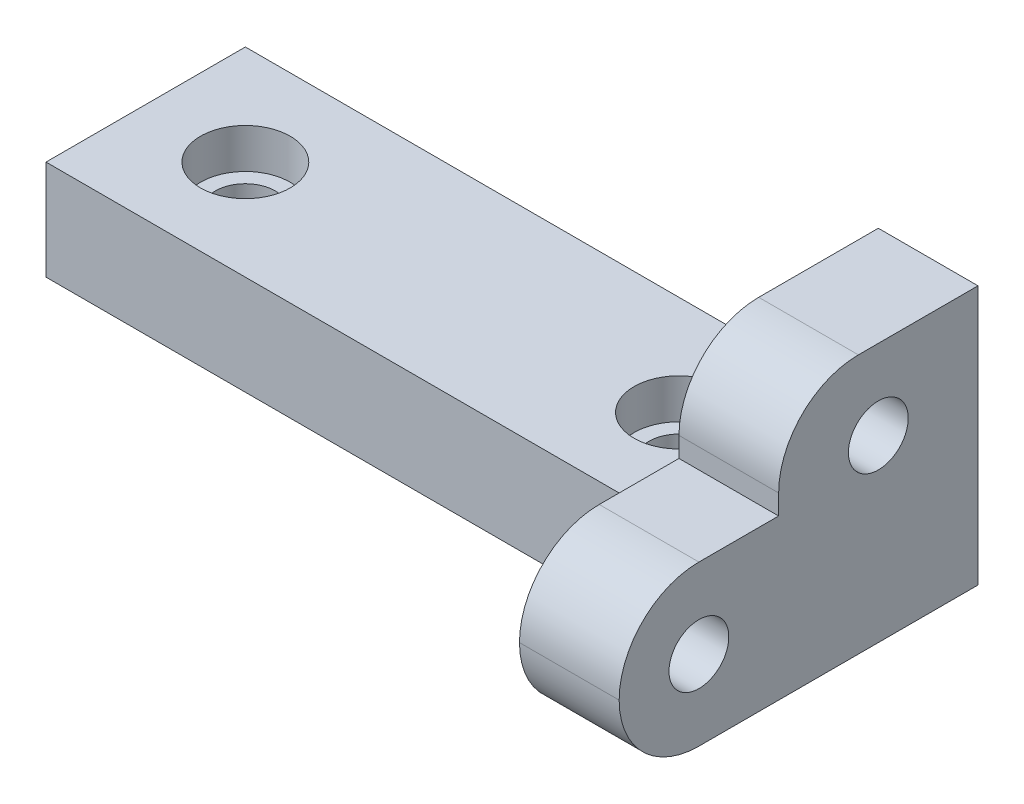
ISO-10303-21;
HEADER;
FILE_DESCRIPTION(('STEP AP214'),'2;1');
FILE_NAME('part.step','',(''),(''),'','','');
FILE_SCHEMA(('AUTOMOTIVE_DESIGN { 1 0 10303 214 1 1 1 1 }'));
ENDSEC;
DATA;
#1=APPLICATION_CONTEXT('core data for automotive mechanical design processes');
#2=APPLICATION_PROTOCOL_DEFINITION('international standard','automotive_design',2000,#1);
#3=PRODUCT_CONTEXT('',#1,'mechanical');
#4=PRODUCT('Part','Part','',(#3));
#5=PRODUCT_RELATED_PRODUCT_CATEGORY('part','',(#4));
#6=PRODUCT_DEFINITION_FORMATION('','',#4);
#7=PRODUCT_DEFINITION_CONTEXT('part definition',#1,'design');
#8=PRODUCT_DEFINITION('design','',#6,#7);
#9=PRODUCT_DEFINITION_SHAPE('','',#8);
#10=(LENGTH_UNIT() NAMED_UNIT(*) SI_UNIT(.MILLI.,.METRE.));
#11=(NAMED_UNIT(*) PLANE_ANGLE_UNIT() SI_UNIT($,.RADIAN.));
#12=(NAMED_UNIT(*) SI_UNIT($,.STERADIAN.) SOLID_ANGLE_UNIT());
#13=UNCERTAINTY_MEASURE_WITH_UNIT(LENGTH_MEASURE(1.E-05),#10,'distance_accuracy_value','');
#14=(GEOMETRIC_REPRESENTATION_CONTEXT(3) GLOBAL_UNCERTAINTY_ASSIGNED_CONTEXT((#13)) GLOBAL_UNIT_ASSIGNED_CONTEXT((#10,
#11,#12)) REPRESENTATION_CONTEXT('',''));
#15=CARTESIAN_POINT('',(0.,0.,0.));
#16=DIRECTION('',(0.,0.,1.));
#17=DIRECTION('',(1.,0.,0.));
#18=AXIS2_PLACEMENT_3D('',#15,#16,#17);
#19=CARTESIAN_POINT('',(0.,9.,5.));
#20=DIRECTION('',(-1.,0.,0.));
#21=DIRECTION('',(0.,0.,1.));
#22=AXIS2_PLACEMENT_3D('',#19,#20,#21);
#23=CYLINDRICAL_SURFACE('',#22,1.5);
#24=CARTESIAN_POINT('',(0.,9.,5.));
#25=DIRECTION('',(-1.,0.,0.));
#26=DIRECTION('',(0.,0.,1.));
#27=AXIS2_PLACEMENT_3D('',#24,#25,#26);
#28=CIRCLE('',#27,1.5);
#29=CARTESIAN_POINT('',(0.,9.,6.5));
#30=VERTEX_POINT('',#29);
#31=EDGE_CURVE('E146',#30,#30,#28,.T.);
#32=ORIENTED_EDGE('',*,*,#31,.F.);
#33=EDGE_LOOP('',(#32));
#34=FACE_BOUND('',#33,.T.);
#35=CARTESIAN_POINT('',(-3.,9.,5.));
#36=DIRECTION('',(-1.,0.,0.));
#37=DIRECTION('',(0.,0.,1.));
#38=AXIS2_PLACEMENT_3D('',#35,#36,#37);
#39=CIRCLE('',#38,1.5);
#40=CARTESIAN_POINT('',(-3.,9.,6.5));
#41=VERTEX_POINT('',#40);
#42=EDGE_CURVE('E193',#41,#41,#39,.F.);
#43=ORIENTED_EDGE('',*,*,#42,.F.);
#44=EDGE_LOOP('',(#43));
#45=FACE_BOUND('',#44,.T.);
#46=ADVANCED_FACE('F35',(#34,#45),#23,.F.);
#47=CARTESIAN_POINT('',(0.,4.,14.));
#48=DIRECTION('',(-1.,0.,0.));
#49=DIRECTION('',(0.,0.,1.));
#50=AXIS2_PLACEMENT_3D('',#47,#48,#49);
#51=CYLINDRICAL_SURFACE('',#50,1.5);
#52=CARTESIAN_POINT('',(0.,4.,14.));
#53=DIRECTION('',(-1.,0.,0.));
#54=DIRECTION('',(0.,0.,1.));
#55=AXIS2_PLACEMENT_3D('',#52,#53,#54);
#56=CIRCLE('',#55,1.5);
#57=CARTESIAN_POINT('',(0.,4.,15.5));
#58=VERTEX_POINT('',#57);
#59=EDGE_CURVE('E197',#58,#58,#56,.T.);
#60=ORIENTED_EDGE('',*,*,#59,.F.);
#61=EDGE_LOOP('',(#60));
#62=FACE_BOUND('',#61,.T.);
#63=CARTESIAN_POINT('',(-3.,4.,14.));
#64=DIRECTION('',(-1.,0.,0.));
#65=DIRECTION('',(0.,0.,1.));
#66=AXIS2_PLACEMENT_3D('',#63,#64,#65);
#67=CIRCLE('',#66,1.5);
#68=CARTESIAN_POINT('',(-3.,4.,15.5));
#69=VERTEX_POINT('',#68);
#70=EDGE_CURVE('E190',#69,#69,#67,.F.);
#71=ORIENTED_EDGE('',*,*,#70,.F.);
#72=EDGE_LOOP('',(#71));
#73=FACE_BOUND('',#72,.T.);
#74=ADVANCED_FACE('F262',(#62,#73),#51,.F.);
#75=CARTESIAN_POINT('',(0.,5.,0.));
#76=DIRECTION('',(0.,-1.,0.));
#77=DIRECTION('',(0.,0.,-1.));
#78=AXIS2_PLACEMENT_3D('',#75,#76,#77);
#79=PLANE('',#78);
#80=CARTESIAN_POINT('',(-31.75,5.,5.));
#81=DIRECTION('',(0.,1.,0.));
#82=DIRECTION('',(0.,0.,1.));
#83=AXIS2_PLACEMENT_3D('',#80,#81,#82);
#84=CIRCLE('',#83,2.25);
#85=CARTESIAN_POINT('',(-31.75,5.,7.25));
#86=VERTEX_POINT('',#85);
#87=EDGE_CURVE('E374',#86,#86,#84,.T.);
#88=ORIENTED_EDGE('',*,*,#87,.F.);
#89=EDGE_LOOP('',(#88));
#90=FACE_BOUND('',#89,.T.);
#91=CARTESIAN_POINT('',(-10.,5.,5.));
#92=DIRECTION('',(0.,1.,0.));
#93=DIRECTION('',(0.,0.,1.));
#94=AXIS2_PLACEMENT_3D('',#91,#92,#93);
#95=CIRCLE('',#94,2.25);
#96=CARTESIAN_POINT('',(-10.,5.,7.25));
#97=VERTEX_POINT('',#96);
#98=EDGE_CURVE('E371',#97,#97,#95,.T.);
#99=ORIENTED_EDGE('',*,*,#98,.F.);
#100=EDGE_LOOP('',(#99));
#101=FACE_BOUND('',#100,.T.);
#102=DIRECTION('',(0.,0.,1.));
#103=VECTOR('',#102,1.);
#104=CARTESIAN_POINT('',(-5.,5.,0.));
#105=LINE('',#104,#103);
#106=CARTESIAN_POINT('',(-5.,5.,0.));
#107=VERTEX_POINT('',#106);
#108=CARTESIAN_POINT('',(-5.,5.,10.));
#109=VERTEX_POINT('',#108);
#110=EDGE_CURVE('E154',#107,#109,#105,.T.);
#111=ORIENTED_EDGE('',*,*,#110,.F.);
#112=DIRECTION('',(-1.,0.,0.));
#113=VECTOR('',#112,1.);
#114=CARTESIAN_POINT('',(0.,5.,0.));
#115=LINE('',#114,#113);
#116=CARTESIAN_POINT('',(-36.75,5.,0.));
#117=VERTEX_POINT('',#116);
#118=EDGE_CURVE('E174',#107,#117,#115,.T.);
#119=ORIENTED_EDGE('',*,*,#118,.T.);
#120=DIRECTION('',(0.,0.,1.));
#121=VECTOR('',#120,1.);
#122=CARTESIAN_POINT('',(-36.75,5.,0.));
#123=LINE('',#122,#121);
#124=CARTESIAN_POINT('',(-36.75,5.,10.));
#125=VERTEX_POINT('',#124);
#126=EDGE_CURVE('E170',#117,#125,#123,.T.);
#127=ORIENTED_EDGE('',*,*,#126,.T.);
#128=DIRECTION('',(-1.,0.,0.));
#129=VECTOR('',#128,1.);
#130=CARTESIAN_POINT('',(0.,5.,10.));
#131=LINE('',#130,#129);
#132=EDGE_CURVE('E168',#109,#125,#131,.T.);
#133=ORIENTED_EDGE('',*,*,#132,.F.);
#134=EDGE_LOOP('',(#111,#119,#127,#133));
#135=FACE_BOUND('',#134,.T.);
#136=ADVANCED_FACE('F233',(#90,#101,#135),#79,.F.);
#137=CARTESIAN_POINT('',(0.,5.,0.));
#138=DIRECTION('',(1.,0.,0.));
#139=DIRECTION('',(0.,0.,-1.));
#140=AXIS2_PLACEMENT_3D('',#137,#138,#139);
#141=PLANE('',#140);
#142=ORIENTED_EDGE('',*,*,#59,.T.);
#143=EDGE_LOOP('',(#142));
#144=FACE_BOUND('',#143,.T.);
#145=ORIENTED_EDGE('',*,*,#31,.T.);
#146=EDGE_LOOP('',(#145));
#147=FACE_BOUND('',#146,.T.);
#148=DIRECTION('',(0.,0.,1.));
#149=VECTOR('',#148,1.);
#150=CARTESIAN_POINT('',(0.,13.,0.));
#151=LINE('',#150,#149);
#152=CARTESIAN_POINT('',(0.,13.,0.));
#153=VERTEX_POINT('',#152);
#154=CARTESIAN_POINT('',(0.,13.,6.));
#155=VERTEX_POINT('',#154);
#156=EDGE_CURVE('E160',#153,#155,#151,.T.);
#157=ORIENTED_EDGE('',*,*,#156,.T.);
#158=CARTESIAN_POINT('',(0.,9.,6.));
#159=DIRECTION('',(1.,0.,0.));
#160=DIRECTION('',(0.,0.,-1.));
#161=AXIS2_PLACEMENT_3D('',#158,#159,#160);
#162=CIRCLE('',#161,4.);
#163=CARTESIAN_POINT('',(0.,9.,10.));
#164=VERTEX_POINT('',#163);
#165=EDGE_CURVE('E124',#155,#164,#162,.T.);
#166=ORIENTED_EDGE('',*,*,#165,.T.);
#167=DIRECTION('',(0.,-1.,0.));
#168=VECTOR('',#167,1.);
#169=CARTESIAN_POINT('',(0.,13.,10.));
#170=LINE('',#169,#168);
#171=CARTESIAN_POINT('',(0.,8.,10.));
#172=VERTEX_POINT('',#171);
#173=EDGE_CURVE('E117',#164,#172,#170,.T.);
#174=ORIENTED_EDGE('',*,*,#173,.T.);
#175=DIRECTION('',(0.,0.,1.));
#176=VECTOR('',#175,1.);
#177=CARTESIAN_POINT('',(0.,8.,10.));
#178=LINE('',#177,#176);
#179=CARTESIAN_POINT('',(0.,8.,14.));
#180=VERTEX_POINT('',#179);
#181=EDGE_CURVE('E122',#172,#180,#178,.T.);
#182=ORIENTED_EDGE('',*,*,#181,.T.);
#183=CARTESIAN_POINT('',(0.,4.,14.));
#184=DIRECTION('',(1.,0.,0.));
#185=DIRECTION('',(0.,0.,-1.));
#186=AXIS2_PLACEMENT_3D('',#183,#184,#185);
#187=CIRCLE('',#186,4.);
#188=CARTESIAN_POINT('',(0.,4.,18.));
#189=VERTEX_POINT('',#188);
#190=EDGE_CURVE('E56',#180,#189,#187,.T.);
#191=ORIENTED_EDGE('',*,*,#190,.T.);
#192=CARTESIAN_POINT('',(0.,4.,14.));
#193=DIRECTION('',(1.,0.,0.));
#194=DIRECTION('',(0.,0.,-1.));
#195=AXIS2_PLACEMENT_3D('',#192,#193,#194);
#196=CIRCLE('',#195,4.);
#197=CARTESIAN_POINT('',(0.,0.,14.));
#198=VERTEX_POINT('',#197);
#199=EDGE_CURVE('E51',#189,#198,#196,.T.);
#200=ORIENTED_EDGE('',*,*,#199,.T.);
#201=DIRECTION('',(0.,0.,1.));
#202=VECTOR('',#201,1.);
#203=CARTESIAN_POINT('',(0.,0.,0.));
#204=LINE('',#203,#202);
#205=CARTESIAN_POINT('',(0.,0.,0.));
#206=VERTEX_POINT('',#205);
#207=EDGE_CURVE('E167',#206,#198,#204,.T.);
#208=ORIENTED_EDGE('',*,*,#207,.F.);
#209=DIRECTION('',(0.,-1.,0.));
#210=VECTOR('',#209,1.);
#211=CARTESIAN_POINT('',(0.,5.,0.));
#212=LINE('',#211,#210);
#213=EDGE_CURVE('E152',#153,#206,#212,.T.);
#214=ORIENTED_EDGE('',*,*,#213,.F.);
#215=EDGE_LOOP('',(#157,#166,#174,#182,#191,#200,#208,#214));
#216=FACE_BOUND('',#215,.T.);
#217=ADVANCED_FACE('F120',(#144,#147,#216),#141,.T.);
#218=CARTESIAN_POINT('',(0.,5.,0.));
#219=DIRECTION('',(0.,0.,1.));
#220=DIRECTION('',(1.,0.,0.));
#221=AXIS2_PLACEMENT_3D('',#218,#219,#220);
#222=PLANE('',#221);
#223=DIRECTION('',(-1.,0.,0.));
#224=VECTOR('',#223,1.);
#225=CARTESIAN_POINT('',(0.,0.,0.));
#226=LINE('',#225,#224);
#227=CARTESIAN_POINT('',(-36.75,0.,0.));
#228=VERTEX_POINT('',#227);
#229=EDGE_CURVE('E171',#206,#228,#226,.T.);
#230=ORIENTED_EDGE('',*,*,#229,.T.);
#231=DIRECTION('',(0.,-1.,0.));
#232=VECTOR('',#231,1.);
#233=CARTESIAN_POINT('',(-36.75,5.,0.));
#234=LINE('',#233,#232);
#235=EDGE_CURVE('E185',#117,#228,#234,.T.);
#236=ORIENTED_EDGE('',*,*,#235,.F.);
#237=ORIENTED_EDGE('',*,*,#118,.F.);
#238=DIRECTION('',(0.,-1.,0.));
#239=VECTOR('',#238,1.);
#240=CARTESIAN_POINT('',(-5.,13.,0.));
#241=LINE('',#240,#239);
#242=CARTESIAN_POINT('',(-5.,13.,0.));
#243=VERTEX_POINT('',#242);
#244=EDGE_CURVE('E162',#243,#107,#241,.T.);
#245=ORIENTED_EDGE('',*,*,#244,.F.);
#246=DIRECTION('',(-1.,0.,0.));
#247=VECTOR('',#246,1.);
#248=CARTESIAN_POINT('',(0.,13.,0.));
#249=LINE('',#248,#247);
#250=EDGE_CURVE('E158',#153,#243,#249,.T.);
#251=ORIENTED_EDGE('',*,*,#250,.F.);
#252=ORIENTED_EDGE('',*,*,#213,.T.);
#253=EDGE_LOOP('',(#230,#236,#237,#245,#251,#252));
#254=FACE_BOUND('',#253,.T.);
#255=ADVANCED_FACE('F245',(#254),#222,.F.);
#256=CARTESIAN_POINT('',(-36.75,5.,0.));
#257=DIRECTION('',(1.,0.,0.));
#258=DIRECTION('',(0.,0.,-1.));
#259=AXIS2_PLACEMENT_3D('',#256,#257,#258);
#260=PLANE('',#259);
#261=DIRECTION('',(0.,0.,1.));
#262=VECTOR('',#261,1.);
#263=CARTESIAN_POINT('',(-36.75,0.,0.));
#264=LINE('',#263,#262);
#265=CARTESIAN_POINT('',(-36.75,0.,10.));
#266=VERTEX_POINT('',#265);
#267=EDGE_CURVE('E180',#228,#266,#264,.T.);
#268=ORIENTED_EDGE('',*,*,#267,.T.);
#269=DIRECTION('',(0.,-1.,0.));
#270=VECTOR('',#269,1.);
#271=CARTESIAN_POINT('',(-36.75,5.,10.));
#272=LINE('',#271,#270);
#273=EDGE_CURVE('E176',#125,#266,#272,.T.);
#274=ORIENTED_EDGE('',*,*,#273,.F.);
#275=ORIENTED_EDGE('',*,*,#126,.F.);
#276=ORIENTED_EDGE('',*,*,#235,.T.);
#277=EDGE_LOOP('',(#268,#274,#275,#276));
#278=FACE_BOUND('',#277,.T.);
#279=ADVANCED_FACE('F239',(#278),#260,.F.);
#280=CARTESIAN_POINT('',(0.,5.,10.));
#281=DIRECTION('',(0.,0.,1.));
#282=DIRECTION('',(1.,0.,0.));
#283=AXIS2_PLACEMENT_3D('',#280,#281,#282);
#284=PLANE('',#283);
#285=DIRECTION('',(0.,-1.,0.));
#286=VECTOR('',#285,1.);
#287=CARTESIAN_POINT('',(-5.,13.,10.));
#288=LINE('',#287,#286);
#289=CARTESIAN_POINT('',(-5.,0.,10.));
#290=VERTEX_POINT('',#289);
#291=EDGE_CURVE('E148',#109,#290,#288,.T.);
#292=ORIENTED_EDGE('',*,*,#291,.F.);
#293=ORIENTED_EDGE('',*,*,#132,.T.);
#294=ORIENTED_EDGE('',*,*,#273,.T.);
#295=DIRECTION('',(-1.,0.,0.));
#296=VECTOR('',#295,1.);
#297=CARTESIAN_POINT('',(0.,0.,10.));
#298=LINE('',#297,#296);
#299=EDGE_CURVE('E178',#290,#266,#298,.T.);
#300=ORIENTED_EDGE('',*,*,#299,.F.);
#301=EDGE_LOOP('',(#292,#293,#294,#300));
#302=FACE_BOUND('',#301,.T.);
#303=ADVANCED_FACE('F231',(#302),#284,.T.);
#304=CARTESIAN_POINT('',(0.,0.,0.));
#305=DIRECTION('',(0.,-1.,0.));
#306=DIRECTION('',(0.,0.,-1.));
#307=AXIS2_PLACEMENT_3D('',#304,#305,#306);
#308=PLANE('',#307);
#309=CARTESIAN_POINT('',(-31.75,0.,5.));
#310=DIRECTION('',(0.,1.,0.));
#311=DIRECTION('',(0.,0.,1.));
#312=AXIS2_PLACEMENT_3D('',#309,#310,#311);
#313=CIRCLE('',#312,1.5);
#314=CARTESIAN_POINT('',(-31.75,0.,6.5));
#315=VERTEX_POINT('',#314);
#316=EDGE_CURVE('E202',#315,#315,#313,.T.);
#317=ORIENTED_EDGE('',*,*,#316,.T.);
#318=EDGE_LOOP('',(#317));
#319=FACE_BOUND('',#318,.T.);
#320=CARTESIAN_POINT('',(-10.,0.,5.));
#321=DIRECTION('',(0.,1.,0.));
#322=DIRECTION('',(0.,0.,1.));
#323=AXIS2_PLACEMENT_3D('',#320,#321,#322);
#324=CIRCLE('',#323,1.5);
#325=CARTESIAN_POINT('',(-10.,0.,6.5));
#326=VERTEX_POINT('',#325);
#327=EDGE_CURVE('E254',#326,#326,#324,.T.);
#328=ORIENTED_EDGE('',*,*,#327,.T.);
#329=EDGE_LOOP('',(#328));
#330=FACE_BOUND('',#329,.T.);
#331=ORIENTED_EDGE('',*,*,#207,.T.);
#332=DIRECTION('',(1.,0.,0.));
#333=VECTOR('',#332,1.);
#334=CARTESIAN_POINT('',(0.,0.,14.));
#335=LINE('',#334,#333);
#336=CARTESIAN_POINT('',(-5.,0.,14.));
#337=VERTEX_POINT('',#336);
#338=EDGE_CURVE('E44',#198,#337,#335,.F.);
#339=ORIENTED_EDGE('',*,*,#338,.T.);
#340=DIRECTION('',(0.,0.,-1.));
#341=VECTOR('',#340,1.);
#342=CARTESIAN_POINT('',(-5.,0.,18.));
#343=LINE('',#342,#341);
#344=EDGE_CURVE('E138',#337,#290,#343,.T.);
#345=ORIENTED_EDGE('',*,*,#344,.T.);
#346=ORIENTED_EDGE('',*,*,#299,.T.);
#347=ORIENTED_EDGE('',*,*,#267,.F.);
#348=ORIENTED_EDGE('',*,*,#229,.F.);
#349=EDGE_LOOP('',(#331,#339,#345,#346,#347,#348));
#350=FACE_BOUND('',#349,.T.);
#351=ADVANCED_FACE('F222',(#319,#330,#350),#308,.T.);
#352=CARTESIAN_POINT('',(-5.,13.,0.));
#353=DIRECTION('',(1.,0.,0.));
#354=DIRECTION('',(0.,0.,-1.));
#355=AXIS2_PLACEMENT_3D('',#352,#353,#354);
#356=PLANE('',#355);
#357=CARTESIAN_POINT('',(-5.,9.,5.));
#358=DIRECTION('',(-1.,0.,0.));
#359=DIRECTION('',(0.,0.,1.));
#360=AXIS2_PLACEMENT_3D('',#357,#358,#359);
#361=CIRCLE('',#360,2.25);
#362=CARTESIAN_POINT('',(-5.,9.,7.25));
#363=VERTEX_POINT('',#362);
#364=EDGE_CURVE('E352',#363,#363,#361,.T.);
#365=ORIENTED_EDGE('',*,*,#364,.F.);
#366=EDGE_LOOP('',(#365));
#367=FACE_BOUND('',#366,.T.);
#368=CARTESIAN_POINT('',(-5.,4.,14.));
#369=DIRECTION('',(-1.,0.,0.));
#370=DIRECTION('',(0.,0.,1.));
#371=AXIS2_PLACEMENT_3D('',#368,#369,#370);
#372=CIRCLE('',#371,2.25);
#373=CARTESIAN_POINT('',(-5.,4.,16.25));
#374=VERTEX_POINT('',#373);
#375=EDGE_CURVE('E350',#374,#374,#372,.T.);
#376=ORIENTED_EDGE('',*,*,#375,.F.);
#377=EDGE_LOOP('',(#376));
#378=FACE_BOUND('',#377,.T.);
#379=DIRECTION('',(0.,-1.,0.));
#380=VECTOR('',#379,1.);
#381=CARTESIAN_POINT('',(-5.,13.,10.));
#382=LINE('',#381,#380);
#383=CARTESIAN_POINT('',(-5.,9.,10.));
#384=VERTEX_POINT('',#383);
#385=CARTESIAN_POINT('',(-5.,8.,10.));
#386=VERTEX_POINT('',#385);
#387=EDGE_CURVE('E134',#384,#386,#382,.T.);
#388=ORIENTED_EDGE('',*,*,#387,.F.);
#389=CARTESIAN_POINT('',(-5.,9.,6.));
#390=DIRECTION('',(1.,0.,0.));
#391=DIRECTION('',(0.,0.,-1.));
#392=AXIS2_PLACEMENT_3D('',#389,#390,#391);
#393=CIRCLE('',#392,4.);
#394=CARTESIAN_POINT('',(-5.,13.,6.));
#395=VERTEX_POINT('',#394);
#396=EDGE_CURVE('E211',#384,#395,#393,.F.);
#397=ORIENTED_EDGE('',*,*,#396,.T.);
#398=DIRECTION('',(0.,0.,1.));
#399=VECTOR('',#398,1.);
#400=CARTESIAN_POINT('',(-5.,13.,0.));
#401=LINE('',#400,#399);
#402=EDGE_CURVE('E155',#243,#395,#401,.T.);
#403=ORIENTED_EDGE('',*,*,#402,.F.);
#404=ORIENTED_EDGE('',*,*,#244,.T.);
#405=ORIENTED_EDGE('',*,*,#110,.T.);
#406=ORIENTED_EDGE('',*,*,#291,.T.);
#407=ORIENTED_EDGE('',*,*,#344,.F.);
#408=CARTESIAN_POINT('',(-5.,4.,14.));
#409=DIRECTION('',(1.,0.,0.));
#410=DIRECTION('',(0.,0.,-1.));
#411=AXIS2_PLACEMENT_3D('',#408,#409,#410);
#412=CIRCLE('',#411,4.);
#413=CARTESIAN_POINT('',(-5.,4.,18.));
#414=VERTEX_POINT('',#413);
#415=EDGE_CURVE('E209',#337,#414,#412,.F.);
#416=ORIENTED_EDGE('',*,*,#415,.T.);
#417=CARTESIAN_POINT('',(-5.,4.,14.));
#418=DIRECTION('',(1.,0.,0.));
#419=DIRECTION('',(0.,0.,-1.));
#420=AXIS2_PLACEMENT_3D('',#417,#418,#419);
#421=CIRCLE('',#420,4.);
#422=CARTESIAN_POINT('',(-5.,8.,14.));
#423=VERTEX_POINT('',#422);
#424=EDGE_CURVE('E207',#414,#423,#421,.F.);
#425=ORIENTED_EDGE('',*,*,#424,.T.);
#426=DIRECTION('',(0.,0.,1.));
#427=VECTOR('',#426,1.);
#428=CARTESIAN_POINT('',(-5.,8.,10.));
#429=LINE('',#428,#427);
#430=EDGE_CURVE('E128',#386,#423,#429,.T.);
#431=ORIENTED_EDGE('',*,*,#430,.F.);
#432=EDGE_LOOP('',(#388,#397,#403,#404,#405,#406,#407,#416,#425,#431));
#433=FACE_BOUND('',#432,.T.);
#434=ADVANCED_FACE('F227',(#367,#378,#433),#356,.F.);
#435=CARTESIAN_POINT('',(0.,13.,0.));
#436=DIRECTION('',(0.,1.,0.));
#437=DIRECTION('',(0.,0.,1.));
#438=AXIS2_PLACEMENT_3D('',#435,#436,#437);
#439=PLANE('',#438);
#440=ORIENTED_EDGE('',*,*,#402,.T.);
#441=DIRECTION('',(-1.,0.,0.));
#442=VECTOR('',#441,1.);
#443=CARTESIAN_POINT('',(0.,13.,6.));
#444=LINE('',#443,#442);
#445=EDGE_CURVE('E213',#395,#155,#444,.F.);
#446=ORIENTED_EDGE('',*,*,#445,.T.);
#447=ORIENTED_EDGE('',*,*,#156,.F.);
#448=ORIENTED_EDGE('',*,*,#250,.T.);
#449=EDGE_LOOP('',(#440,#446,#447,#448));
#450=FACE_BOUND('',#449,.T.);
#451=ADVANCED_FACE('F248',(#450),#439,.T.);
#452=CARTESIAN_POINT('',(0.,13.,10.));
#453=DIRECTION('',(0.,0.,-1.));
#454=DIRECTION('',(-1.,0.,0.));
#455=AXIS2_PLACEMENT_3D('',#452,#453,#454);
#456=PLANE('',#455);
#457=ORIENTED_EDGE('',*,*,#173,.F.);
#458=DIRECTION('',(-1.,0.,0.));
#459=VECTOR('',#458,1.);
#460=CARTESIAN_POINT('',(-5.,9.,10.));
#461=LINE('',#460,#459);
#462=EDGE_CURVE('E151',#164,#384,#461,.T.);
#463=ORIENTED_EDGE('',*,*,#462,.T.);
#464=ORIENTED_EDGE('',*,*,#387,.T.);
#465=DIRECTION('',(-1.,0.,0.));
#466=VECTOR('',#465,1.);
#467=CARTESIAN_POINT('',(0.,8.,10.));
#468=LINE('',#467,#466);
#469=EDGE_CURVE('E131',#172,#386,#468,.T.);
#470=ORIENTED_EDGE('',*,*,#469,.F.);
#471=EDGE_LOOP('',(#457,#463,#464,#470));
#472=FACE_BOUND('',#471,.T.);
#473=ADVANCED_FACE('F132',(#472),#456,.F.);
#474=CARTESIAN_POINT('',(0.,8.,10.));
#475=DIRECTION('',(0.,-1.,0.));
#476=DIRECTION('',(0.,0.,-1.));
#477=AXIS2_PLACEMENT_3D('',#474,#475,#476);
#478=PLANE('',#477);
#479=ORIENTED_EDGE('',*,*,#430,.T.);
#480=DIRECTION('',(-1.,0.,0.));
#481=VECTOR('',#480,1.);
#482=CARTESIAN_POINT('',(0.,8.,14.));
#483=LINE('',#482,#481);
#484=EDGE_CURVE('E11',#423,#180,#483,.F.);
#485=ORIENTED_EDGE('',*,*,#484,.T.);
#486=ORIENTED_EDGE('',*,*,#181,.F.);
#487=ORIENTED_EDGE('',*,*,#469,.T.);
#488=EDGE_LOOP('',(#479,#485,#486,#487));
#489=FACE_BOUND('',#488,.T.);
#490=ADVANCED_FACE('F140',(#489),#478,.F.);
#491=CARTESIAN_POINT('',(-3.,4.,14.));
#492=DIRECTION('',(-1.,0.,0.));
#493=DIRECTION('',(0.,0.,1.));
#494=AXIS2_PLACEMENT_3D('',#491,#492,#493);
#495=PLANE('',#494);
#496=CARTESIAN_POINT('',(-3.,4.,14.));
#497=DIRECTION('',(-1.,0.,0.));
#498=DIRECTION('',(0.,0.,1.));
#499=AXIS2_PLACEMENT_3D('',#496,#497,#498);
#500=CIRCLE('',#499,2.25);
#501=CARTESIAN_POINT('',(-3.,4.,16.25));
#502=VERTEX_POINT('',#501);
#503=EDGE_CURVE('E347',#502,#502,#500,.T.);
#504=ORIENTED_EDGE('',*,*,#503,.T.);
#505=EDGE_LOOP('',(#504));
#506=FACE_BOUND('',#505,.T.);
#507=ORIENTED_EDGE('',*,*,#70,.T.);
#508=EDGE_LOOP('',(#507));
#509=FACE_BOUND('',#508,.T.);
#510=ADVANCED_FACE('F273',(#506,#509),#495,.T.);
#511=CARTESIAN_POINT('',(-3.,4.,14.));
#512=DIRECTION('',(-1.,0.,0.));
#513=DIRECTION('',(0.,0.,1.));
#514=AXIS2_PLACEMENT_3D('',#511,#512,#513);
#515=CYLINDRICAL_SURFACE('',#514,2.25);
#516=ORIENTED_EDGE('',*,*,#503,.F.);
#517=EDGE_LOOP('',(#516));
#518=FACE_BOUND('',#517,.T.);
#519=ORIENTED_EDGE('',*,*,#375,.T.);
#520=EDGE_LOOP('',(#519));
#521=FACE_BOUND('',#520,.T.);
#522=ADVANCED_FACE('F334',(#518,#521),#515,.F.);
#523=CARTESIAN_POINT('',(-3.,9.,5.));
#524=DIRECTION('',(-1.,0.,0.));
#525=DIRECTION('',(0.,0.,1.));
#526=AXIS2_PLACEMENT_3D('',#523,#524,#525);
#527=PLANE('',#526);
#528=CARTESIAN_POINT('',(-3.,9.,5.));
#529=DIRECTION('',(-1.,0.,0.));
#530=DIRECTION('',(0.,0.,1.));
#531=AXIS2_PLACEMENT_3D('',#528,#529,#530);
#532=CIRCLE('',#531,2.25);
#533=CARTESIAN_POINT('',(-3.,9.,7.25));
#534=VERTEX_POINT('',#533);
#535=EDGE_CURVE('E194',#534,#534,#532,.T.);
#536=ORIENTED_EDGE('',*,*,#535,.T.);
#537=EDGE_LOOP('',(#536));
#538=FACE_BOUND('',#537,.T.);
#539=ORIENTED_EDGE('',*,*,#42,.T.);
#540=EDGE_LOOP('',(#539));
#541=FACE_BOUND('',#540,.T.);
#542=ADVANCED_FACE('F331',(#538,#541),#527,.T.);
#543=CARTESIAN_POINT('',(-3.,9.,5.));
#544=DIRECTION('',(-1.,0.,0.));
#545=DIRECTION('',(0.,0.,1.));
#546=AXIS2_PLACEMENT_3D('',#543,#544,#545);
#547=CYLINDRICAL_SURFACE('',#546,2.25);
#548=ORIENTED_EDGE('',*,*,#535,.F.);
#549=EDGE_LOOP('',(#548));
#550=FACE_BOUND('',#549,.T.);
#551=ORIENTED_EDGE('',*,*,#364,.T.);
#552=EDGE_LOOP('',(#551));
#553=FACE_BOUND('',#552,.T.);
#554=ADVANCED_FACE('F326',(#550,#553),#547,.F.);
#555=CARTESIAN_POINT('',(-10.,3.,5.));
#556=DIRECTION('',(0.,1.,0.));
#557=DIRECTION('',(0.,0.,1.));
#558=AXIS2_PLACEMENT_3D('',#555,#556,#557);
#559=CYLINDRICAL_SURFACE('',#558,2.25);
#560=CARTESIAN_POINT('',(-10.,3.,5.));
#561=DIRECTION('',(0.,1.,0.));
#562=DIRECTION('',(0.,0.,1.));
#563=AXIS2_PLACEMENT_3D('',#560,#561,#562);
#564=CIRCLE('',#563,2.25);
#565=CARTESIAN_POINT('',(-10.,3.,7.25));
#566=VERTEX_POINT('',#565);
#567=EDGE_CURVE('E205',#566,#566,#564,.T.);
#568=ORIENTED_EDGE('',*,*,#567,.F.);
#569=EDGE_LOOP('',(#568));
#570=FACE_BOUND('',#569,.T.);
#571=ORIENTED_EDGE('',*,*,#98,.T.);
#572=EDGE_LOOP('',(#571));
#573=FACE_BOUND('',#572,.T.);
#574=ADVANCED_FACE('F323',(#570,#573),#559,.F.);
#575=CARTESIAN_POINT('',(-10.,3.,5.));
#576=DIRECTION('',(0.,1.,0.));
#577=DIRECTION('',(0.,0.,1.));
#578=AXIS2_PLACEMENT_3D('',#575,#576,#577);
#579=PLANE('',#578);
#580=CARTESIAN_POINT('',(-10.,3.,5.));
#581=DIRECTION('',(0.,1.,0.));
#582=DIRECTION('',(0.,0.,1.));
#583=AXIS2_PLACEMENT_3D('',#580,#581,#582);
#584=CIRCLE('',#583,1.5);
#585=CARTESIAN_POINT('',(-10.,3.,6.5));
#586=VERTEX_POINT('',#585);
#587=EDGE_CURVE('E201',#586,#586,#584,.T.);
#588=ORIENTED_EDGE('',*,*,#587,.F.);
#589=EDGE_LOOP('',(#588));
#590=FACE_BOUND('',#589,.T.);
#591=ORIENTED_EDGE('',*,*,#567,.T.);
#592=EDGE_LOOP('',(#591));
#593=FACE_BOUND('',#592,.T.);
#594=ADVANCED_FACE('F321',(#590,#593),#579,.T.);
#595=CARTESIAN_POINT('',(-31.75,3.,5.));
#596=DIRECTION('',(0.,1.,0.));
#597=DIRECTION('',(0.,0.,1.));
#598=AXIS2_PLACEMENT_3D('',#595,#596,#597);
#599=CYLINDRICAL_SURFACE('',#598,2.25);
#600=CARTESIAN_POINT('',(-31.75,3.,5.));
#601=DIRECTION('',(0.,1.,0.));
#602=DIRECTION('',(0.,0.,1.));
#603=AXIS2_PLACEMENT_3D('',#600,#601,#602);
#604=CIRCLE('',#603,2.25);
#605=CARTESIAN_POINT('',(-31.75,3.,7.25));
#606=VERTEX_POINT('',#605);
#607=EDGE_CURVE('E356',#606,#606,#604,.T.);
#608=ORIENTED_EDGE('',*,*,#607,.F.);
#609=EDGE_LOOP('',(#608));
#610=FACE_BOUND('',#609,.T.);
#611=ORIENTED_EDGE('',*,*,#87,.T.);
#612=EDGE_LOOP('',(#611));
#613=FACE_BOUND('',#612,.T.);
#614=ADVANCED_FACE('F317',(#610,#613),#599,.F.);
#615=CARTESIAN_POINT('',(-31.75,3.,5.));
#616=DIRECTION('',(0.,1.,0.));
#617=DIRECTION('',(0.,0.,1.));
#618=AXIS2_PLACEMENT_3D('',#615,#616,#617);
#619=PLANE('',#618);
#620=CARTESIAN_POINT('',(-31.75,3.,5.));
#621=DIRECTION('',(0.,1.,0.));
#622=DIRECTION('',(0.,0.,1.));
#623=AXIS2_PLACEMENT_3D('',#620,#621,#622);
#624=CIRCLE('',#623,1.5);
#625=CARTESIAN_POINT('',(-31.75,3.,6.5));
#626=VERTEX_POINT('',#625);
#627=EDGE_CURVE('E198',#626,#626,#624,.T.);
#628=ORIENTED_EDGE('',*,*,#627,.F.);
#629=EDGE_LOOP('',(#628));
#630=FACE_BOUND('',#629,.T.);
#631=ORIENTED_EDGE('',*,*,#607,.T.);
#632=EDGE_LOOP('',(#631));
#633=FACE_BOUND('',#632,.T.);
#634=ADVANCED_FACE('F310',(#630,#633),#619,.T.);
#635=CARTESIAN_POINT('',(-31.75,0.,5.));
#636=DIRECTION('',(0.,1.,0.));
#637=DIRECTION('',(0.,0.,1.));
#638=AXIS2_PLACEMENT_3D('',#635,#636,#637);
#639=CYLINDRICAL_SURFACE('',#638,1.5);
#640=ORIENTED_EDGE('',*,*,#627,.T.);
#641=EDGE_LOOP('',(#640));
#642=FACE_BOUND('',#641,.T.);
#643=ORIENTED_EDGE('',*,*,#316,.F.);
#644=EDGE_LOOP('',(#643));
#645=FACE_BOUND('',#644,.T.);
#646=ADVANCED_FACE('F304',(#642,#645),#639,.F.);
#647=CARTESIAN_POINT('',(-10.,0.,5.));
#648=DIRECTION('',(0.,1.,0.));
#649=DIRECTION('',(0.,0.,1.));
#650=AXIS2_PLACEMENT_3D('',#647,#648,#649);
#651=CYLINDRICAL_SURFACE('',#650,1.5);
#652=ORIENTED_EDGE('',*,*,#587,.T.);
#653=EDGE_LOOP('',(#652));
#654=FACE_BOUND('',#653,.T.);
#655=ORIENTED_EDGE('',*,*,#327,.F.);
#656=EDGE_LOOP('',(#655));
#657=FACE_BOUND('',#656,.T.);
#658=ADVANCED_FACE('F300',(#654,#657),#651,.F.);
#659=CARTESIAN_POINT('',(0.,9.,6.));
#660=DIRECTION('',(1.,0.,0.));
#661=DIRECTION('',(0.,0.,-1.));
#662=AXIS2_PLACEMENT_3D('',#659,#660,#661);
#663=CYLINDRICAL_SURFACE('',#662,4.);
#664=ORIENTED_EDGE('',*,*,#165,.F.);
#665=ORIENTED_EDGE('',*,*,#445,.F.);
#666=ORIENTED_EDGE('',*,*,#396,.F.);
#667=ORIENTED_EDGE('',*,*,#462,.F.);
#668=EDGE_LOOP('',(#664,#665,#666,#667));
#669=FACE_BOUND('',#668,.T.);
#670=ADVANCED_FACE('F251',(#669),#663,.T.);
#671=CARTESIAN_POINT('',(0.,4.,14.));
#672=DIRECTION('',(1.,0.,0.));
#673=DIRECTION('',(0.,0.,-1.));
#674=AXIS2_PLACEMENT_3D('',#671,#672,#673);
#675=CYLINDRICAL_SURFACE('',#674,4.);
#676=ORIENTED_EDGE('',*,*,#484,.F.);
#677=ORIENTED_EDGE('',*,*,#424,.F.);
#678=DIRECTION('',(-1.,0.,0.));
#679=VECTOR('',#678,1.);
#680=CARTESIAN_POINT('',(-5.,4.,18.));
#681=LINE('',#680,#679);
#682=EDGE_CURVE('E39',#189,#414,#681,.T.);
#683=ORIENTED_EDGE('',*,*,#682,.F.);
#684=ORIENTED_EDGE('',*,*,#190,.F.);
#685=EDGE_LOOP('',(#676,#677,#683,#684));
#686=FACE_BOUND('',#685,.T.);
#687=ADVANCED_FACE('F37',(#686),#675,.T.);
#688=CARTESIAN_POINT('',(0.,4.,14.));
#689=DIRECTION('',(1.,0.,0.));
#690=DIRECTION('',(0.,0.,-1.));
#691=AXIS2_PLACEMENT_3D('',#688,#689,#690);
#692=CYLINDRICAL_SURFACE('',#691,4.);
#693=ORIENTED_EDGE('',*,*,#415,.F.);
#694=ORIENTED_EDGE('',*,*,#338,.F.);
#695=ORIENTED_EDGE('',*,*,#199,.F.);
#696=ORIENTED_EDGE('',*,*,#682,.T.);
#697=EDGE_LOOP('',(#693,#694,#695,#696));
#698=FACE_BOUND('',#697,.T.);
#699=ADVANCED_FACE('F255',(#698),#692,.T.);
#700=CLOSED_SHELL('',(#46,#74,#136,#217,#255,#279,#303,#351,#434,#451,#473,#490,#510,#522,#542,
#554,#574,#594,#614,#634,#646,#658,#670,#687,#699));
#701=MANIFOLD_SOLID_BREP('B2',#700);
#702=ADVANCED_BREP_SHAPE_REPRESENTATION('',(#18,#701),#14);
#703=SHAPE_DEFINITION_REPRESENTATION(#9,#702);
ENDSEC;
END-ISO-10303-21;
